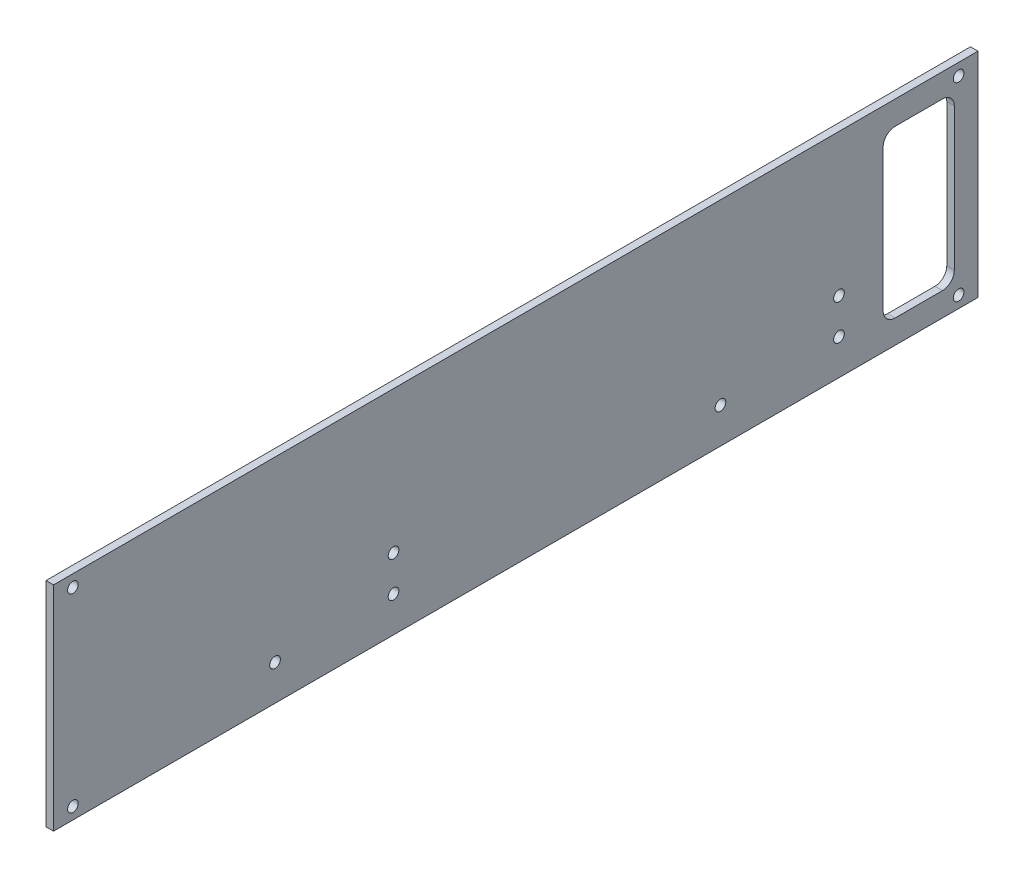
ISO-10303-21;
HEADER;
FILE_DESCRIPTION(('STEP AP214'),'2;1');
FILE_NAME('part.step','',(''),(''),'','','');
FILE_SCHEMA(('AUTOMOTIVE_DESIGN { 1 0 10303 214 1 1 1 1 }'));
ENDSEC;
DATA;
#1=APPLICATION_CONTEXT('core data for automotive mechanical design processes');
#2=APPLICATION_PROTOCOL_DEFINITION('international standard','automotive_design',2000,#1);
#3=PRODUCT_CONTEXT('',#1,'mechanical');
#4=PRODUCT('Part','Part','',(#3));
#5=PRODUCT_RELATED_PRODUCT_CATEGORY('part','',(#4));
#6=PRODUCT_DEFINITION_FORMATION('','',#4);
#7=PRODUCT_DEFINITION_CONTEXT('part definition',#1,'design');
#8=PRODUCT_DEFINITION('design','',#6,#7);
#9=PRODUCT_DEFINITION_SHAPE('','',#8);
#10=(LENGTH_UNIT() NAMED_UNIT(*) SI_UNIT(.MILLI.,.METRE.));
#11=(NAMED_UNIT(*) PLANE_ANGLE_UNIT() SI_UNIT($,.RADIAN.));
#12=(NAMED_UNIT(*) SI_UNIT($,.STERADIAN.) SOLID_ANGLE_UNIT());
#13=UNCERTAINTY_MEASURE_WITH_UNIT(LENGTH_MEASURE(1.E-05),#10,'distance_accuracy_value','');
#14=(GEOMETRIC_REPRESENTATION_CONTEXT(3) GLOBAL_UNCERTAINTY_ASSIGNED_CONTEXT((#13)) GLOBAL_UNIT_ASSIGNED_CONTEXT((#10,
#11,#12)) REPRESENTATION_CONTEXT('',''));
#15=CARTESIAN_POINT('',(0.,0.,0.));
#16=DIRECTION('',(0.,0.,1.));
#17=DIRECTION('',(1.,0.,0.));
#18=AXIS2_PLACEMENT_3D('',#15,#16,#17);
#19=CARTESIAN_POINT('',(0.,0.,0.));
#20=DIRECTION('',(-1.,0.,0.));
#21=DIRECTION('',(0.,0.,1.));
#22=AXIS2_PLACEMENT_3D('',#19,#20,#21);
#23=PLANE('',#22);
#24=CARTESIAN_POINT('',(0.,40.,-186.825));
#25=DIRECTION('',(1.,0.,0.));
#26=DIRECTION('',(0.,0.,-1.));
#27=AXIS2_PLACEMENT_3D('',#24,#25,#26);
#28=CIRCLE('',#27,2.25);
#29=CARTESIAN_POINT('',(0.,40.,-189.075));
#30=VERTEX_POINT('',#29);
#31=EDGE_CURVE('E359',#30,#30,#28,.T.);
#32=ORIENTED_EDGE('',*,*,#31,.T.);
#33=EDGE_LOOP('',(#32));
#34=FACE_BOUND('',#33,.T.);
#35=CARTESIAN_POINT('',(0.,-40.,-186.825));
#36=DIRECTION('',(1.,0.,0.));
#37=DIRECTION('',(0.,0.,-1.));
#38=AXIS2_PLACEMENT_3D('',#35,#36,#37);
#39=CIRCLE('',#38,2.25);
#40=CARTESIAN_POINT('',(0.,-40.,-189.075));
#41=VERTEX_POINT('',#40);
#42=EDGE_CURVE('E369',#41,#41,#39,.T.);
#43=ORIENTED_EDGE('',*,*,#42,.T.);
#44=EDGE_LOOP('',(#43));
#45=FACE_BOUND('',#44,.T.);
#46=CARTESIAN_POINT('',(0.,40.,186.825));
#47=DIRECTION('',(1.,0.,0.));
#48=DIRECTION('',(0.,0.,-1.));
#49=AXIS2_PLACEMENT_3D('',#46,#47,#48);
#50=CIRCLE('',#49,2.25);
#51=CARTESIAN_POINT('',(0.,40.,184.575));
#52=VERTEX_POINT('',#51);
#53=EDGE_CURVE('E375',#52,#52,#50,.T.);
#54=ORIENTED_EDGE('',*,*,#53,.T.);
#55=EDGE_LOOP('',(#54));
#56=FACE_BOUND('',#55,.T.);
#57=CARTESIAN_POINT('',(0.,-40.,186.825));
#58=DIRECTION('',(1.,0.,0.));
#59=DIRECTION('',(0.,0.,-1.));
#60=AXIS2_PLACEMENT_3D('',#57,#58,#59);
#61=CIRCLE('',#60,2.25);
#62=CARTESIAN_POINT('',(0.,-40.,184.575));
#63=VERTEX_POINT('',#62);
#64=EDGE_CURVE('E216',#63,#63,#61,.T.);
#65=ORIENTED_EDGE('',*,*,#64,.T.);
#66=EDGE_LOOP('',(#65));
#67=FACE_BOUND('',#66,.T.);
#68=DIRECTION('',(0.,0.,-1.));
#69=VECTOR('',#68,1.);
#70=CARTESIAN_POINT('',(0.,-35.,-155.));
#71=LINE('',#70,#69);
#72=CARTESIAN_POINT('',(0.,-35.,-160.));
#73=VERTEX_POINT('',#72);
#74=CARTESIAN_POINT('',(0.,-35.,-180.));
#75=VERTEX_POINT('',#74);
#76=EDGE_CURVE('E206',#73,#75,#71,.T.);
#77=ORIENTED_EDGE('',*,*,#76,.T.);
#78=CARTESIAN_POINT('',(0.,-30.,-180.));
#79=DIRECTION('',(-1.,0.,0.));
#80=DIRECTION('',(0.,0.,1.));
#81=AXIS2_PLACEMENT_3D('',#78,#79,#80);
#82=CIRCLE('',#81,5.);
#83=CARTESIAN_POINT('',(0.,-30.,-185.));
#84=VERTEX_POINT('',#83);
#85=EDGE_CURVE('E11',#75,#84,#82,.F.);
#86=ORIENTED_EDGE('',*,*,#85,.T.);
#87=DIRECTION('',(0.,1.,0.));
#88=VECTOR('',#87,1.);
#89=CARTESIAN_POINT('',(0.,-35.,-185.));
#90=LINE('',#89,#88);
#91=CARTESIAN_POINT('',(0.,30.,-185.));
#92=VERTEX_POINT('',#91);
#93=EDGE_CURVE('E198',#84,#92,#90,.T.);
#94=ORIENTED_EDGE('',*,*,#93,.T.);
#95=CARTESIAN_POINT('',(0.,30.,-180.));
#96=DIRECTION('',(-1.,0.,0.));
#97=DIRECTION('',(0.,0.,1.));
#98=AXIS2_PLACEMENT_3D('',#95,#96,#97);
#99=CIRCLE('',#98,5.);
#100=CARTESIAN_POINT('',(0.,35.,-180.));
#101=VERTEX_POINT('',#100);
#102=EDGE_CURVE('E178',#92,#101,#99,.F.);
#103=ORIENTED_EDGE('',*,*,#102,.T.);
#104=DIRECTION('',(0.,0.,1.));
#105=VECTOR('',#104,1.);
#106=CARTESIAN_POINT('',(0.,35.,-155.));
#107=LINE('',#106,#105);
#108=CARTESIAN_POINT('',(0.,35.,-160.));
#109=VERTEX_POINT('',#108);
#110=EDGE_CURVE('E210',#101,#109,#107,.T.);
#111=ORIENTED_EDGE('',*,*,#110,.T.);
#112=CARTESIAN_POINT('',(0.,30.,-160.));
#113=DIRECTION('',(-1.,0.,0.));
#114=DIRECTION('',(0.,0.,1.));
#115=AXIS2_PLACEMENT_3D('',#112,#113,#114);
#116=CIRCLE('',#115,5.);
#117=CARTESIAN_POINT('',(0.,30.,-155.));
#118=VERTEX_POINT('',#117);
#119=EDGE_CURVE('E182',#109,#118,#116,.F.);
#120=ORIENTED_EDGE('',*,*,#119,.T.);
#121=DIRECTION('',(0.,-1.,0.));
#122=VECTOR('',#121,1.);
#123=CARTESIAN_POINT('',(0.,-35.,-155.));
#124=LINE('',#123,#122);
#125=CARTESIAN_POINT('',(0.,-30.,-155.));
#126=VERTEX_POINT('',#125);
#127=EDGE_CURVE('E213',#118,#126,#124,.T.);
#128=ORIENTED_EDGE('',*,*,#127,.T.);
#129=CARTESIAN_POINT('',(0.,-30.,-160.));
#130=DIRECTION('',(-1.,0.,0.));
#131=DIRECTION('',(0.,0.,1.));
#132=AXIS2_PLACEMENT_3D('',#129,#130,#131);
#133=CIRCLE('',#132,5.);
#134=EDGE_CURVE('E59',#126,#73,#133,.F.);
#135=ORIENTED_EDGE('',*,*,#134,.T.);
#136=EDGE_LOOP('',(#77,#86,#94,#103,#111,#120,#128,#135));
#137=FACE_BOUND('',#136,.T.);
#138=CARTESIAN_POINT('',(0.,-30.,101.563539669185));
#139=DIRECTION('',(1.,0.,0.));
#140=DIRECTION('',(0.,0.,-1.));
#141=AXIS2_PLACEMENT_3D('',#138,#139,#140);
#142=CIRCLE('',#141,2.25);
#143=CARTESIAN_POINT('',(0.,-30.,99.3135396691852));
#144=VERTEX_POINT('',#143);
#145=EDGE_CURVE('E230',#144,#144,#142,.T.);
#146=ORIENTED_EDGE('',*,*,#145,.T.);
#147=EDGE_LOOP('',(#146));
#148=FACE_BOUND('',#147,.T.);
#149=CARTESIAN_POINT('',(0.,-30.,51.5635396691852));
#150=DIRECTION('',(1.,0.,0.));
#151=DIRECTION('',(0.,0.,-1.));
#152=AXIS2_PLACEMENT_3D('',#149,#150,#151);
#153=CIRCLE('',#152,2.25);
#154=CARTESIAN_POINT('',(0.,-30.,49.3135396691852));
#155=VERTEX_POINT('',#154);
#156=EDGE_CURVE('E236',#155,#155,#153,.T.);
#157=ORIENTED_EDGE('',*,*,#156,.T.);
#158=EDGE_LOOP('',(#157));
#159=FACE_BOUND('',#158,.T.);
#160=DIRECTION('',(0.,1.,0.));
#161=VECTOR('',#160,1.);
#162=CARTESIAN_POINT('',(0.,-45.,-195.));
#163=LINE('',#162,#161);
#164=CARTESIAN_POINT('',(0.,-45.,-195.));
#165=VERTEX_POINT('',#164);
#166=CARTESIAN_POINT('',(0.,45.,-195.));
#167=VERTEX_POINT('',#166);
#168=EDGE_CURVE('E151',#165,#167,#163,.T.);
#169=ORIENTED_EDGE('',*,*,#168,.F.);
#170=DIRECTION('',(0.,0.,-1.));
#171=VECTOR('',#170,1.);
#172=CARTESIAN_POINT('',(0.,-45.,195.));
#173=LINE('',#172,#171);
#174=CARTESIAN_POINT('',(0.,-45.,195.));
#175=VERTEX_POINT('',#174);
#176=EDGE_CURVE('E147',#175,#165,#173,.T.);
#177=ORIENTED_EDGE('',*,*,#176,.F.);
#178=DIRECTION('',(0.,-1.,0.));
#179=VECTOR('',#178,1.);
#180=CARTESIAN_POINT('',(0.,-45.,195.));
#181=LINE('',#180,#179);
#182=CARTESIAN_POINT('',(0.,45.,195.));
#183=VERTEX_POINT('',#182);
#184=EDGE_CURVE('E269',#183,#175,#181,.T.);
#185=ORIENTED_EDGE('',*,*,#184,.F.);
#186=DIRECTION('',(0.,0.,1.));
#187=VECTOR('',#186,1.);
#188=CARTESIAN_POINT('',(0.,45.,195.));
#189=LINE('',#188,#187);
#190=EDGE_CURVE('E267',#167,#183,#189,.T.);
#191=ORIENTED_EDGE('',*,*,#190,.F.);
#192=EDGE_LOOP('',(#169,#177,#185,#191));
#193=FACE_BOUND('',#192,.T.);
#194=CARTESIAN_POINT('',(0.,-15.,-136.351636822524));
#195=DIRECTION('',(1.,0.,0.));
#196=DIRECTION('',(0.,0.,-1.));
#197=AXIS2_PLACEMENT_3D('',#194,#195,#196);
#198=CIRCLE('',#197,2.25);
#199=CARTESIAN_POINT('',(0.,-15.,-138.601636822524));
#200=VERTEX_POINT('',#199);
#201=EDGE_CURVE('E260',#200,#200,#198,.T.);
#202=ORIENTED_EDGE('',*,*,#201,.T.);
#203=EDGE_LOOP('',(#202));
#204=FACE_BOUND('',#203,.T.);
#205=CARTESIAN_POINT('',(0.,-30.,-136.351636822524));
#206=DIRECTION('',(1.,0.,0.));
#207=DIRECTION('',(0.,0.,-1.));
#208=AXIS2_PLACEMENT_3D('',#205,#206,#207);
#209=CIRCLE('',#208,2.25);
#210=CARTESIAN_POINT('',(0.,-30.,-138.601636822524));
#211=VERTEX_POINT('',#210);
#212=EDGE_CURVE('E254',#211,#211,#209,.T.);
#213=ORIENTED_EDGE('',*,*,#212,.T.);
#214=EDGE_LOOP('',(#213));
#215=FACE_BOUND('',#214,.T.);
#216=CARTESIAN_POINT('',(0.,-30.,-86.3516368225238));
#217=DIRECTION('',(1.,0.,0.));
#218=DIRECTION('',(0.,0.,-1.));
#219=AXIS2_PLACEMENT_3D('',#216,#217,#218);
#220=CIRCLE('',#219,2.25);
#221=CARTESIAN_POINT('',(0.,-30.,-88.6016368225238));
#222=VERTEX_POINT('',#221);
#223=EDGE_CURVE('E248',#222,#222,#220,.T.);
#224=ORIENTED_EDGE('',*,*,#223,.T.);
#225=EDGE_LOOP('',(#224));
#226=FACE_BOUND('',#225,.T.);
#227=CARTESIAN_POINT('',(0.,-15.,51.5635396691852));
#228=DIRECTION('',(1.,0.,0.));
#229=DIRECTION('',(0.,0.,-1.));
#230=AXIS2_PLACEMENT_3D('',#227,#228,#229);
#231=CIRCLE('',#230,2.25);
#232=CARTESIAN_POINT('',(0.,-15.,49.3135396691852));
#233=VERTEX_POINT('',#232);
#234=EDGE_CURVE('E242',#233,#233,#231,.T.);
#235=ORIENTED_EDGE('',*,*,#234,.T.);
#236=EDGE_LOOP('',(#235));
#237=FACE_BOUND('',#236,.T.);
#238=ADVANCED_FACE('F37',(#34,#45,#56,#67,#137,#148,#159,#193,#204,#215,#226,#237),#23,.T.);
#239=CARTESIAN_POINT('',(3.175,-45.,-195.));
#240=DIRECTION('',(0.,0.,1.));
#241=DIRECTION('',(1.,0.,0.));
#242=AXIS2_PLACEMENT_3D('',#239,#240,#241);
#243=PLANE('',#242);
#244=ORIENTED_EDGE('',*,*,#168,.T.);
#245=DIRECTION('',(-1.,0.,0.));
#246=VECTOR('',#245,1.);
#247=CARTESIAN_POINT('',(3.175,45.,-195.));
#248=LINE('',#247,#246);
#249=CARTESIAN_POINT('',(3.175,45.,-195.));
#250=VERTEX_POINT('',#249);
#251=EDGE_CURVE('E131',#250,#167,#248,.T.);
#252=ORIENTED_EDGE('',*,*,#251,.F.);
#253=DIRECTION('',(0.,1.,0.));
#254=VECTOR('',#253,1.);
#255=CARTESIAN_POINT('',(3.175,-45.,-195.));
#256=LINE('',#255,#254);
#257=CARTESIAN_POINT('',(3.175,-45.,-195.));
#258=VERTEX_POINT('',#257);
#259=EDGE_CURVE('E138',#258,#250,#256,.T.);
#260=ORIENTED_EDGE('',*,*,#259,.F.);
#261=DIRECTION('',(-1.,0.,0.));
#262=VECTOR('',#261,1.);
#263=CARTESIAN_POINT('',(3.175,-45.,-195.));
#264=LINE('',#263,#262);
#265=EDGE_CURVE('E265',#258,#165,#264,.T.);
#266=ORIENTED_EDGE('',*,*,#265,.T.);
#267=EDGE_LOOP('',(#244,#252,#260,#266));
#268=FACE_BOUND('',#267,.T.);
#269=ADVANCED_FACE('F149',(#268),#243,.F.);
#270=CARTESIAN_POINT('',(3.175,45.,195.));
#271=DIRECTION('',(0.,-1.,0.));
#272=DIRECTION('',(0.,0.,-1.));
#273=AXIS2_PLACEMENT_3D('',#270,#271,#272);
#274=PLANE('',#273);
#275=ORIENTED_EDGE('',*,*,#190,.T.);
#276=DIRECTION('',(-1.,0.,0.));
#277=VECTOR('',#276,1.);
#278=CARTESIAN_POINT('',(3.175,45.,195.));
#279=LINE('',#278,#277);
#280=CARTESIAN_POINT('',(3.175,45.,195.));
#281=VERTEX_POINT('',#280);
#282=EDGE_CURVE('E134',#281,#183,#279,.T.);
#283=ORIENTED_EDGE('',*,*,#282,.F.);
#284=DIRECTION('',(0.,0.,1.));
#285=VECTOR('',#284,1.);
#286=CARTESIAN_POINT('',(3.175,45.,195.));
#287=LINE('',#286,#285);
#288=EDGE_CURVE('E127',#250,#281,#287,.T.);
#289=ORIENTED_EDGE('',*,*,#288,.F.);
#290=ORIENTED_EDGE('',*,*,#251,.T.);
#291=EDGE_LOOP('',(#275,#283,#289,#290));
#292=FACE_BOUND('',#291,.T.);
#293=ADVANCED_FACE('F129',(#292),#274,.F.);
#294=CARTESIAN_POINT('',(3.175,-45.,195.));
#295=DIRECTION('',(0.,0.,-1.));
#296=DIRECTION('',(-1.,0.,0.));
#297=AXIS2_PLACEMENT_3D('',#294,#295,#296);
#298=PLANE('',#297);
#299=ORIENTED_EDGE('',*,*,#184,.T.);
#300=DIRECTION('',(-1.,0.,0.));
#301=VECTOR('',#300,1.);
#302=CARTESIAN_POINT('',(3.175,-45.,195.));
#303=LINE('',#302,#301);
#304=CARTESIAN_POINT('',(3.175,-45.,195.));
#305=VERTEX_POINT('',#304);
#306=EDGE_CURVE('E156',#305,#175,#303,.T.);
#307=ORIENTED_EDGE('',*,*,#306,.F.);
#308=DIRECTION('',(0.,-1.,0.));
#309=VECTOR('',#308,1.);
#310=CARTESIAN_POINT('',(3.175,-45.,195.));
#311=LINE('',#310,#309);
#312=EDGE_CURVE('E137',#281,#305,#311,.T.);
#313=ORIENTED_EDGE('',*,*,#312,.F.);
#314=ORIENTED_EDGE('',*,*,#282,.T.);
#315=EDGE_LOOP('',(#299,#307,#313,#314));
#316=FACE_BOUND('',#315,.T.);
#317=ADVANCED_FACE('F281',(#316),#298,.F.);
#318=CARTESIAN_POINT('',(3.175,-45.,195.));
#319=DIRECTION('',(0.,1.,0.));
#320=DIRECTION('',(0.,0.,1.));
#321=AXIS2_PLACEMENT_3D('',#318,#319,#320);
#322=PLANE('',#321);
#323=ORIENTED_EDGE('',*,*,#176,.T.);
#324=ORIENTED_EDGE('',*,*,#265,.F.);
#325=DIRECTION('',(0.,0.,-1.));
#326=VECTOR('',#325,1.);
#327=CARTESIAN_POINT('',(3.175,-45.,195.));
#328=LINE('',#327,#326);
#329=EDGE_CURVE('E143',#305,#258,#328,.T.);
#330=ORIENTED_EDGE('',*,*,#329,.F.);
#331=ORIENTED_EDGE('',*,*,#306,.T.);
#332=EDGE_LOOP('',(#323,#324,#330,#331));
#333=FACE_BOUND('',#332,.T.);
#334=ADVANCED_FACE('F276',(#333),#322,.F.);
#335=CARTESIAN_POINT('',(3.175,0.,0.));
#336=DIRECTION('',(-1.,0.,0.));
#337=DIRECTION('',(0.,0.,1.));
#338=AXIS2_PLACEMENT_3D('',#335,#336,#337);
#339=PLANE('',#338);
#340=CARTESIAN_POINT('',(3.175,40.,-186.825));
#341=DIRECTION('',(1.,0.,0.));
#342=DIRECTION('',(0.,0.,-1.));
#343=AXIS2_PLACEMENT_3D('',#340,#341,#342);
#344=CIRCLE('',#343,2.24999999999999);
#345=CARTESIAN_POINT('',(3.175,40.,-189.075));
#346=VERTEX_POINT('',#345);
#347=EDGE_CURVE('E362',#346,#346,#344,.T.);
#348=ORIENTED_EDGE('',*,*,#347,.F.);
#349=EDGE_LOOP('',(#348));
#350=FACE_BOUND('',#349,.T.);
#351=CARTESIAN_POINT('',(3.175,-40.,-186.825));
#352=DIRECTION('',(1.,0.,0.));
#353=DIRECTION('',(0.,0.,-1.));
#354=AXIS2_PLACEMENT_3D('',#351,#352,#353);
#355=CIRCLE('',#354,2.24999999999999);
#356=CARTESIAN_POINT('',(3.175,-40.,-189.075));
#357=VERTEX_POINT('',#356);
#358=EDGE_CURVE('E364',#357,#357,#355,.T.);
#359=ORIENTED_EDGE('',*,*,#358,.F.);
#360=EDGE_LOOP('',(#359));
#361=FACE_BOUND('',#360,.T.);
#362=CARTESIAN_POINT('',(3.175,40.,186.825));
#363=DIRECTION('',(1.,0.,0.));
#364=DIRECTION('',(0.,0.,-1.));
#365=AXIS2_PLACEMENT_3D('',#362,#363,#364);
#366=CIRCLE('',#365,2.24999999999999);
#367=CARTESIAN_POINT('',(3.175,40.,184.575));
#368=VERTEX_POINT('',#367);
#369=EDGE_CURVE('E372',#368,#368,#366,.T.);
#370=ORIENTED_EDGE('',*,*,#369,.F.);
#371=EDGE_LOOP('',(#370));
#372=FACE_BOUND('',#371,.T.);
#373=CARTESIAN_POINT('',(3.175,-40.,186.825));
#374=DIRECTION('',(1.,0.,0.));
#375=DIRECTION('',(0.,0.,-1.));
#376=AXIS2_PLACEMENT_3D('',#373,#374,#375);
#377=CIRCLE('',#376,2.24999999999999);
#378=CARTESIAN_POINT('',(3.175,-40.,184.575));
#379=VERTEX_POINT('',#378);
#380=EDGE_CURVE('E377',#379,#379,#377,.T.);
#381=ORIENTED_EDGE('',*,*,#380,.F.);
#382=EDGE_LOOP('',(#381));
#383=FACE_BOUND('',#382,.T.);
#384=DIRECTION('',(0.,0.,1.));
#385=VECTOR('',#384,1.);
#386=CARTESIAN_POINT('',(3.175,35.,-155.));
#387=LINE('',#386,#385);
#388=CARTESIAN_POINT('',(3.175,35.,-180.));
#389=VERTEX_POINT('',#388);
#390=CARTESIAN_POINT('',(3.175,35.,-160.));
#391=VERTEX_POINT('',#390);
#392=EDGE_CURVE('E223',#389,#391,#387,.T.);
#393=ORIENTED_EDGE('',*,*,#392,.F.);
#394=CARTESIAN_POINT('',(3.175,30.,-180.));
#395=DIRECTION('',(-1.,0.,0.));
#396=DIRECTION('',(0.,0.,1.));
#397=AXIS2_PLACEMENT_3D('',#394,#395,#396);
#398=CIRCLE('',#397,5.);
#399=CARTESIAN_POINT('',(3.175,30.,-185.));
#400=VERTEX_POINT('',#399);
#401=EDGE_CURVE('E176',#389,#400,#398,.T.);
#402=ORIENTED_EDGE('',*,*,#401,.T.);
#403=DIRECTION('',(0.,1.,0.));
#404=VECTOR('',#403,1.);
#405=CARTESIAN_POINT('',(3.175,-35.,-185.));
#406=LINE('',#405,#404);
#407=CARTESIAN_POINT('',(3.175,-30.,-185.));
#408=VERTEX_POINT('',#407);
#409=EDGE_CURVE('E193',#408,#400,#406,.T.);
#410=ORIENTED_EDGE('',*,*,#409,.F.);
#411=CARTESIAN_POINT('',(3.175,-30.,-180.));
#412=DIRECTION('',(-1.,0.,0.));
#413=DIRECTION('',(0.,0.,1.));
#414=AXIS2_PLACEMENT_3D('',#411,#412,#413);
#415=CIRCLE('',#414,5.);
#416=CARTESIAN_POINT('',(3.175,-35.,-180.));
#417=VERTEX_POINT('',#416);
#418=EDGE_CURVE('E45',#408,#417,#415,.T.);
#419=ORIENTED_EDGE('',*,*,#418,.T.);
#420=DIRECTION('',(0.,0.,-1.));
#421=VECTOR('',#420,1.);
#422=CARTESIAN_POINT('',(3.175,-35.,-155.));
#423=LINE('',#422,#421);
#424=CARTESIAN_POINT('',(3.175,-35.,-160.));
#425=VERTEX_POINT('',#424);
#426=EDGE_CURVE('E191',#425,#417,#423,.T.);
#427=ORIENTED_EDGE('',*,*,#426,.F.);
#428=CARTESIAN_POINT('',(3.175,-30.,-160.));
#429=DIRECTION('',(-1.,0.,0.));
#430=DIRECTION('',(0.,0.,1.));
#431=AXIS2_PLACEMENT_3D('',#428,#429,#430);
#432=CIRCLE('',#431,5.);
#433=CARTESIAN_POINT('',(3.175,-30.,-155.));
#434=VERTEX_POINT('',#433);
#435=EDGE_CURVE('E184',#425,#434,#432,.T.);
#436=ORIENTED_EDGE('',*,*,#435,.T.);
#437=DIRECTION('',(0.,-1.,0.));
#438=VECTOR('',#437,1.);
#439=CARTESIAN_POINT('',(3.175,-35.,-155.));
#440=LINE('',#439,#438);
#441=CARTESIAN_POINT('',(3.175,30.,-155.));
#442=VERTEX_POINT('',#441);
#443=EDGE_CURVE('E199',#442,#434,#440,.T.);
#444=ORIENTED_EDGE('',*,*,#443,.F.);
#445=CARTESIAN_POINT('',(3.175,30.,-160.));
#446=DIRECTION('',(-1.,0.,0.));
#447=DIRECTION('',(0.,0.,1.));
#448=AXIS2_PLACEMENT_3D('',#445,#446,#447);
#449=CIRCLE('',#448,5.);
#450=EDGE_CURVE('E180',#442,#391,#449,.T.);
#451=ORIENTED_EDGE('',*,*,#450,.T.);
#452=EDGE_LOOP('',(#393,#402,#410,#419,#427,#436,#444,#451));
#453=FACE_BOUND('',#452,.T.);
#454=CARTESIAN_POINT('',(3.175,-30.,101.563539669185));
#455=DIRECTION('',(1.,0.,0.));
#456=DIRECTION('',(0.,0.,-1.));
#457=AXIS2_PLACEMENT_3D('',#454,#455,#456);
#458=CIRCLE('',#457,2.24999999999999);
#459=CARTESIAN_POINT('',(3.175,-30.,99.3135396691852));
#460=VERTEX_POINT('',#459);
#461=EDGE_CURVE('E221',#460,#460,#458,.T.);
#462=ORIENTED_EDGE('',*,*,#461,.F.);
#463=EDGE_LOOP('',(#462));
#464=FACE_BOUND('',#463,.T.);
#465=CARTESIAN_POINT('',(3.175,-30.,51.5635396691852));
#466=DIRECTION('',(1.,0.,0.));
#467=DIRECTION('',(0.,0.,-1.));
#468=AXIS2_PLACEMENT_3D('',#465,#466,#467);
#469=CIRCLE('',#468,2.24999999999999);
#470=CARTESIAN_POINT('',(3.175,-30.,49.3135396691852));
#471=VERTEX_POINT('',#470);
#472=EDGE_CURVE('E233',#471,#471,#469,.T.);
#473=ORIENTED_EDGE('',*,*,#472,.F.);
#474=EDGE_LOOP('',(#473));
#475=FACE_BOUND('',#474,.T.);
#476=CARTESIAN_POINT('',(3.175,-15.,51.5635396691852));
#477=DIRECTION('',(1.,0.,0.));
#478=DIRECTION('',(0.,0.,-1.));
#479=AXIS2_PLACEMENT_3D('',#476,#477,#478);
#480=CIRCLE('',#479,2.24999999999999);
#481=CARTESIAN_POINT('',(3.175,-15.,49.3135396691852));
#482=VERTEX_POINT('',#481);
#483=EDGE_CURVE('E239',#482,#482,#480,.T.);
#484=ORIENTED_EDGE('',*,*,#483,.F.);
#485=EDGE_LOOP('',(#484));
#486=FACE_BOUND('',#485,.T.);
#487=CARTESIAN_POINT('',(3.175,-30.,-86.3516368225238));
#488=DIRECTION('',(1.,0.,0.));
#489=DIRECTION('',(0.,0.,-1.));
#490=AXIS2_PLACEMENT_3D('',#487,#488,#489);
#491=CIRCLE('',#490,2.24999999999999);
#492=CARTESIAN_POINT('',(3.175,-30.,-88.6016368225237));
#493=VERTEX_POINT('',#492);
#494=EDGE_CURVE('E245',#493,#493,#491,.T.);
#495=ORIENTED_EDGE('',*,*,#494,.F.);
#496=EDGE_LOOP('',(#495));
#497=FACE_BOUND('',#496,.T.);
#498=CARTESIAN_POINT('',(3.175,-30.,-136.351636822524));
#499=DIRECTION('',(1.,0.,0.));
#500=DIRECTION('',(0.,0.,-1.));
#501=AXIS2_PLACEMENT_3D('',#498,#499,#500);
#502=CIRCLE('',#501,2.24999999999999);
#503=CARTESIAN_POINT('',(3.175,-30.,-138.601636822524));
#504=VERTEX_POINT('',#503);
#505=EDGE_CURVE('E251',#504,#504,#502,.T.);
#506=ORIENTED_EDGE('',*,*,#505,.F.);
#507=EDGE_LOOP('',(#506));
#508=FACE_BOUND('',#507,.T.);
#509=CARTESIAN_POINT('',(3.175,-15.,-136.351636822524));
#510=DIRECTION('',(1.,0.,0.));
#511=DIRECTION('',(0.,0.,-1.));
#512=AXIS2_PLACEMENT_3D('',#509,#510,#511);
#513=CIRCLE('',#512,2.24999999999999);
#514=CARTESIAN_POINT('',(3.175,-15.,-138.601636822524));
#515=VERTEX_POINT('',#514);
#516=EDGE_CURVE('E257',#515,#515,#513,.T.);
#517=ORIENTED_EDGE('',*,*,#516,.F.);
#518=EDGE_LOOP('',(#517));
#519=FACE_BOUND('',#518,.T.);
#520=ORIENTED_EDGE('',*,*,#259,.T.);
#521=ORIENTED_EDGE('',*,*,#288,.T.);
#522=ORIENTED_EDGE('',*,*,#312,.T.);
#523=ORIENTED_EDGE('',*,*,#329,.T.);
#524=EDGE_LOOP('',(#520,#521,#522,#523));
#525=FACE_BOUND('',#524,.T.);
#526=ADVANCED_FACE('F141',(#350,#361,#372,#383,#453,#464,#475,#486,#497,#508,#519,#525),#339,.F.);
#527=CARTESIAN_POINT('',(3.175,-15.,-136.351636822524));
#528=DIRECTION('',(1.,0.,0.));
#529=DIRECTION('',(0.,0.,-1.));
#530=AXIS2_PLACEMENT_3D('',#527,#528,#529);
#531=CYLINDRICAL_SURFACE('',#530,2.24999999999999);
#532=ORIENTED_EDGE('',*,*,#201,.F.);
#533=EDGE_LOOP('',(#532));
#534=FACE_BOUND('',#533,.T.);
#535=ORIENTED_EDGE('',*,*,#516,.T.);
#536=EDGE_LOOP('',(#535));
#537=FACE_BOUND('',#536,.T.);
#538=ADVANCED_FACE('F302',(#534,#537),#531,.F.);
#539=CARTESIAN_POINT('',(3.175,-30.,-136.351636822524));
#540=DIRECTION('',(1.,0.,0.));
#541=DIRECTION('',(0.,0.,-1.));
#542=AXIS2_PLACEMENT_3D('',#539,#540,#541);
#543=CYLINDRICAL_SURFACE('',#542,2.24999999999999);
#544=ORIENTED_EDGE('',*,*,#212,.F.);
#545=EDGE_LOOP('',(#544));
#546=FACE_BOUND('',#545,.T.);
#547=ORIENTED_EDGE('',*,*,#505,.T.);
#548=EDGE_LOOP('',(#547));
#549=FACE_BOUND('',#548,.T.);
#550=ADVANCED_FACE('F306',(#546,#549),#543,.F.);
#551=CARTESIAN_POINT('',(3.175,-30.,-86.3516368225238));
#552=DIRECTION('',(1.,0.,0.));
#553=DIRECTION('',(0.,0.,-1.));
#554=AXIS2_PLACEMENT_3D('',#551,#552,#553);
#555=CYLINDRICAL_SURFACE('',#554,2.24999999999999);
#556=ORIENTED_EDGE('',*,*,#223,.F.);
#557=EDGE_LOOP('',(#556));
#558=FACE_BOUND('',#557,.T.);
#559=ORIENTED_EDGE('',*,*,#494,.T.);
#560=EDGE_LOOP('',(#559));
#561=FACE_BOUND('',#560,.T.);
#562=ADVANCED_FACE('F310',(#558,#561),#555,.F.);
#563=CARTESIAN_POINT('',(3.175,-15.,51.5635396691852));
#564=DIRECTION('',(1.,0.,0.));
#565=DIRECTION('',(0.,0.,-1.));
#566=AXIS2_PLACEMENT_3D('',#563,#564,#565);
#567=CYLINDRICAL_SURFACE('',#566,2.24999999999999);
#568=ORIENTED_EDGE('',*,*,#234,.F.);
#569=EDGE_LOOP('',(#568));
#570=FACE_BOUND('',#569,.T.);
#571=ORIENTED_EDGE('',*,*,#483,.T.);
#572=EDGE_LOOP('',(#571));
#573=FACE_BOUND('',#572,.T.);
#574=ADVANCED_FACE('F314',(#570,#573),#567,.F.);
#575=CARTESIAN_POINT('',(3.175,-30.,51.5635396691852));
#576=DIRECTION('',(1.,0.,0.));
#577=DIRECTION('',(0.,0.,-1.));
#578=AXIS2_PLACEMENT_3D('',#575,#576,#577);
#579=CYLINDRICAL_SURFACE('',#578,2.24999999999999);
#580=ORIENTED_EDGE('',*,*,#156,.F.);
#581=EDGE_LOOP('',(#580));
#582=FACE_BOUND('',#581,.T.);
#583=ORIENTED_EDGE('',*,*,#472,.T.);
#584=EDGE_LOOP('',(#583));
#585=FACE_BOUND('',#584,.T.);
#586=ADVANCED_FACE('F318',(#582,#585),#579,.F.);
#587=CARTESIAN_POINT('',(3.175,-30.,101.563539669185));
#588=DIRECTION('',(1.,0.,0.));
#589=DIRECTION('',(0.,0.,-1.));
#590=AXIS2_PLACEMENT_3D('',#587,#588,#589);
#591=CYLINDRICAL_SURFACE('',#590,2.24999999999999);
#592=ORIENTED_EDGE('',*,*,#145,.F.);
#593=EDGE_LOOP('',(#592));
#594=FACE_BOUND('',#593,.T.);
#595=ORIENTED_EDGE('',*,*,#461,.T.);
#596=EDGE_LOOP('',(#595));
#597=FACE_BOUND('',#596,.T.);
#598=ADVANCED_FACE('F322',(#594,#597),#591,.F.);
#599=CARTESIAN_POINT('',(0.,-35.,-185.));
#600=DIRECTION('',(0.,0.,-1.));
#601=DIRECTION('',(-1.,0.,0.));
#602=AXIS2_PLACEMENT_3D('',#599,#600,#601);
#603=PLANE('',#602);
#604=ORIENTED_EDGE('',*,*,#409,.T.);
#605=DIRECTION('',(1.,0.,0.));
#606=VECTOR('',#605,1.);
#607=CARTESIAN_POINT('',(0.,30.,-185.));
#608=LINE('',#607,#606);
#609=EDGE_CURVE('E165',#400,#92,#608,.F.);
#610=ORIENTED_EDGE('',*,*,#609,.T.);
#611=ORIENTED_EDGE('',*,*,#93,.F.);
#612=DIRECTION('',(1.,0.,0.));
#613=VECTOR('',#612,1.);
#614=CARTESIAN_POINT('',(3.175,-30.,-185.));
#615=LINE('',#614,#613);
#616=EDGE_CURVE('E162',#84,#408,#615,.T.);
#617=ORIENTED_EDGE('',*,*,#616,.T.);
#618=EDGE_LOOP('',(#604,#610,#611,#617));
#619=FACE_BOUND('',#618,.T.);
#620=ADVANCED_FACE('F208',(#619),#603,.F.);
#621=CARTESIAN_POINT('',(0.,-35.,-155.));
#622=DIRECTION('',(0.,-1.,0.));
#623=DIRECTION('',(0.,0.,-1.));
#624=AXIS2_PLACEMENT_3D('',#621,#622,#623);
#625=PLANE('',#624);
#626=ORIENTED_EDGE('',*,*,#76,.F.);
#627=DIRECTION('',(1.,0.,0.));
#628=VECTOR('',#627,1.);
#629=CARTESIAN_POINT('',(3.175,-35.,-160.));
#630=LINE('',#629,#628);
#631=EDGE_CURVE('E173',#73,#425,#630,.T.);
#632=ORIENTED_EDGE('',*,*,#631,.T.);
#633=ORIENTED_EDGE('',*,*,#426,.T.);
#634=DIRECTION('',(1.,0.,0.));
#635=VECTOR('',#634,1.);
#636=CARTESIAN_POINT('',(0.,-35.,-180.));
#637=LINE('',#636,#635);
#638=EDGE_CURVE('E52',#417,#75,#637,.F.);
#639=ORIENTED_EDGE('',*,*,#638,.T.);
#640=EDGE_LOOP('',(#626,#632,#633,#639));
#641=FACE_BOUND('',#640,.T.);
#642=ADVANCED_FACE('F196',(#641),#625,.F.);
#643=CARTESIAN_POINT('',(0.,-35.,-155.));
#644=DIRECTION('',(0.,0.,1.));
#645=DIRECTION('',(1.,0.,0.));
#646=AXIS2_PLACEMENT_3D('',#643,#644,#645);
#647=PLANE('',#646);
#648=ORIENTED_EDGE('',*,*,#127,.F.);
#649=DIRECTION('',(1.,0.,0.));
#650=VECTOR('',#649,1.);
#651=CARTESIAN_POINT('',(3.175,30.,-155.));
#652=LINE('',#651,#650);
#653=EDGE_CURVE('E169',#118,#442,#652,.T.);
#654=ORIENTED_EDGE('',*,*,#653,.T.);
#655=ORIENTED_EDGE('',*,*,#443,.T.);
#656=DIRECTION('',(1.,0.,0.));
#657=VECTOR('',#656,1.);
#658=CARTESIAN_POINT('',(0.,-30.,-155.));
#659=LINE('',#658,#657);
#660=EDGE_CURVE('E167',#434,#126,#659,.F.);
#661=ORIENTED_EDGE('',*,*,#660,.T.);
#662=EDGE_LOOP('',(#648,#654,#655,#661));
#663=FACE_BOUND('',#662,.T.);
#664=ADVANCED_FACE('F333',(#663),#647,.F.);
#665=CARTESIAN_POINT('',(0.,35.,-155.));
#666=DIRECTION('',(0.,1.,0.));
#667=DIRECTION('',(0.,0.,1.));
#668=AXIS2_PLACEMENT_3D('',#665,#666,#667);
#669=PLANE('',#668);
#670=ORIENTED_EDGE('',*,*,#110,.F.);
#671=DIRECTION('',(1.,0.,0.));
#672=VECTOR('',#671,1.);
#673=CARTESIAN_POINT('',(3.175,35.,-180.));
#674=LINE('',#673,#672);
#675=EDGE_CURVE('E154',#101,#389,#674,.T.);
#676=ORIENTED_EDGE('',*,*,#675,.T.);
#677=ORIENTED_EDGE('',*,*,#392,.T.);
#678=DIRECTION('',(1.,0.,0.));
#679=VECTOR('',#678,1.);
#680=CARTESIAN_POINT('',(0.,35.,-160.));
#681=LINE('',#680,#679);
#682=EDGE_CURVE('E152',#391,#109,#681,.F.);
#683=ORIENTED_EDGE('',*,*,#682,.T.);
#684=EDGE_LOOP('',(#670,#676,#677,#683));
#685=FACE_BOUND('',#684,.T.);
#686=ADVANCED_FACE('F329',(#685),#669,.F.);
#687=CARTESIAN_POINT('',(0.,30.,-180.));
#688=DIRECTION('',(-1.,0.,0.));
#689=DIRECTION('',(0.,0.,1.));
#690=AXIS2_PLACEMENT_3D('',#687,#688,#689);
#691=CYLINDRICAL_SURFACE('',#690,5.);
#692=ORIENTED_EDGE('',*,*,#102,.F.);
#693=ORIENTED_EDGE('',*,*,#609,.F.);
#694=ORIENTED_EDGE('',*,*,#401,.F.);
#695=ORIENTED_EDGE('',*,*,#675,.F.);
#696=EDGE_LOOP('',(#692,#693,#694,#695));
#697=FACE_BOUND('',#696,.T.);
#698=ADVANCED_FACE('F332',(#697),#691,.F.);
#699=CARTESIAN_POINT('',(0.,30.,-160.));
#700=DIRECTION('',(-1.,0.,0.));
#701=DIRECTION('',(0.,0.,1.));
#702=AXIS2_PLACEMENT_3D('',#699,#700,#701);
#703=CYLINDRICAL_SURFACE('',#702,5.);
#704=ORIENTED_EDGE('',*,*,#119,.F.);
#705=ORIENTED_EDGE('',*,*,#682,.F.);
#706=ORIENTED_EDGE('',*,*,#450,.F.);
#707=ORIENTED_EDGE('',*,*,#653,.F.);
#708=EDGE_LOOP('',(#704,#705,#706,#707));
#709=FACE_BOUND('',#708,.T.);
#710=ADVANCED_FACE('F419',(#709),#703,.F.);
#711=CARTESIAN_POINT('',(0.,-30.,-160.));
#712=DIRECTION('',(-1.,0.,0.));
#713=DIRECTION('',(0.,0.,1.));
#714=AXIS2_PLACEMENT_3D('',#711,#712,#713);
#715=CYLINDRICAL_SURFACE('',#714,5.);
#716=ORIENTED_EDGE('',*,*,#134,.F.);
#717=ORIENTED_EDGE('',*,*,#660,.F.);
#718=ORIENTED_EDGE('',*,*,#435,.F.);
#719=ORIENTED_EDGE('',*,*,#631,.F.);
#720=EDGE_LOOP('',(#716,#717,#718,#719));
#721=FACE_BOUND('',#720,.T.);
#722=ADVANCED_FACE('F413',(#721),#715,.F.);
#723=CARTESIAN_POINT('',(0.,-30.,-180.));
#724=DIRECTION('',(-1.,0.,0.));
#725=DIRECTION('',(0.,0.,1.));
#726=AXIS2_PLACEMENT_3D('',#723,#724,#725);
#727=CYLINDRICAL_SURFACE('',#726,5.);
#728=ORIENTED_EDGE('',*,*,#85,.F.);
#729=ORIENTED_EDGE('',*,*,#638,.F.);
#730=ORIENTED_EDGE('',*,*,#418,.F.);
#731=ORIENTED_EDGE('',*,*,#616,.F.);
#732=EDGE_LOOP('',(#728,#729,#730,#731));
#733=FACE_BOUND('',#732,.T.);
#734=ADVANCED_FACE('F39',(#733),#727,.F.);
#735=CARTESIAN_POINT('',(3.175,-40.,186.825));
#736=DIRECTION('',(1.,0.,0.));
#737=DIRECTION('',(0.,0.,-1.));
#738=AXIS2_PLACEMENT_3D('',#735,#736,#737);
#739=CYLINDRICAL_SURFACE('',#738,2.25);
#740=ORIENTED_EDGE('',*,*,#64,.F.);
#741=EDGE_LOOP('',(#740));
#742=FACE_BOUND('',#741,.T.);
#743=ORIENTED_EDGE('',*,*,#380,.T.);
#744=EDGE_LOOP('',(#743));
#745=FACE_BOUND('',#744,.T.);
#746=ADVANCED_FACE('F340',(#742,#745),#739,.F.);
#747=CARTESIAN_POINT('',(3.175,40.,186.825));
#748=DIRECTION('',(1.,0.,0.));
#749=DIRECTION('',(0.,0.,-1.));
#750=AXIS2_PLACEMENT_3D('',#747,#748,#749);
#751=CYLINDRICAL_SURFACE('',#750,2.25);
#752=ORIENTED_EDGE('',*,*,#53,.F.);
#753=EDGE_LOOP('',(#752));
#754=FACE_BOUND('',#753,.T.);
#755=ORIENTED_EDGE('',*,*,#369,.T.);
#756=EDGE_LOOP('',(#755));
#757=FACE_BOUND('',#756,.T.);
#758=ADVANCED_FACE('F343',(#754,#757),#751,.F.);
#759=CARTESIAN_POINT('',(3.175,-40.,-186.825));
#760=DIRECTION('',(1.,0.,0.));
#761=DIRECTION('',(0.,0.,-1.));
#762=AXIS2_PLACEMENT_3D('',#759,#760,#761);
#763=CYLINDRICAL_SURFACE('',#762,2.25);
#764=ORIENTED_EDGE('',*,*,#42,.F.);
#765=EDGE_LOOP('',(#764));
#766=FACE_BOUND('',#765,.T.);
#767=ORIENTED_EDGE('',*,*,#358,.T.);
#768=EDGE_LOOP('',(#767));
#769=FACE_BOUND('',#768,.T.);
#770=ADVANCED_FACE('F347',(#766,#769),#763,.F.);
#771=CARTESIAN_POINT('',(3.175,40.,-186.825));
#772=DIRECTION('',(1.,0.,0.));
#773=DIRECTION('',(0.,0.,-1.));
#774=AXIS2_PLACEMENT_3D('',#771,#772,#773);
#775=CYLINDRICAL_SURFACE('',#774,2.25);
#776=ORIENTED_EDGE('',*,*,#31,.F.);
#777=EDGE_LOOP('',(#776));
#778=FACE_BOUND('',#777,.T.);
#779=ORIENTED_EDGE('',*,*,#347,.T.);
#780=EDGE_LOOP('',(#779));
#781=FACE_BOUND('',#780,.T.);
#782=ADVANCED_FACE('F351',(#778,#781),#775,.F.);
#783=CLOSED_SHELL('',(#238,#269,#293,#317,#334,#526,#538,#550,#562,#574,#586,#598,#620,#642,
#664,#686,#698,#710,#722,#734,#746,#758,#770,#782));
#784=MANIFOLD_SOLID_BREP('B2',#783);
#785=ADVANCED_BREP_SHAPE_REPRESENTATION('',(#18,#784),#14);
#786=SHAPE_DEFINITION_REPRESENTATION(#9,#785);
ENDSEC;
END-ISO-10303-21;
